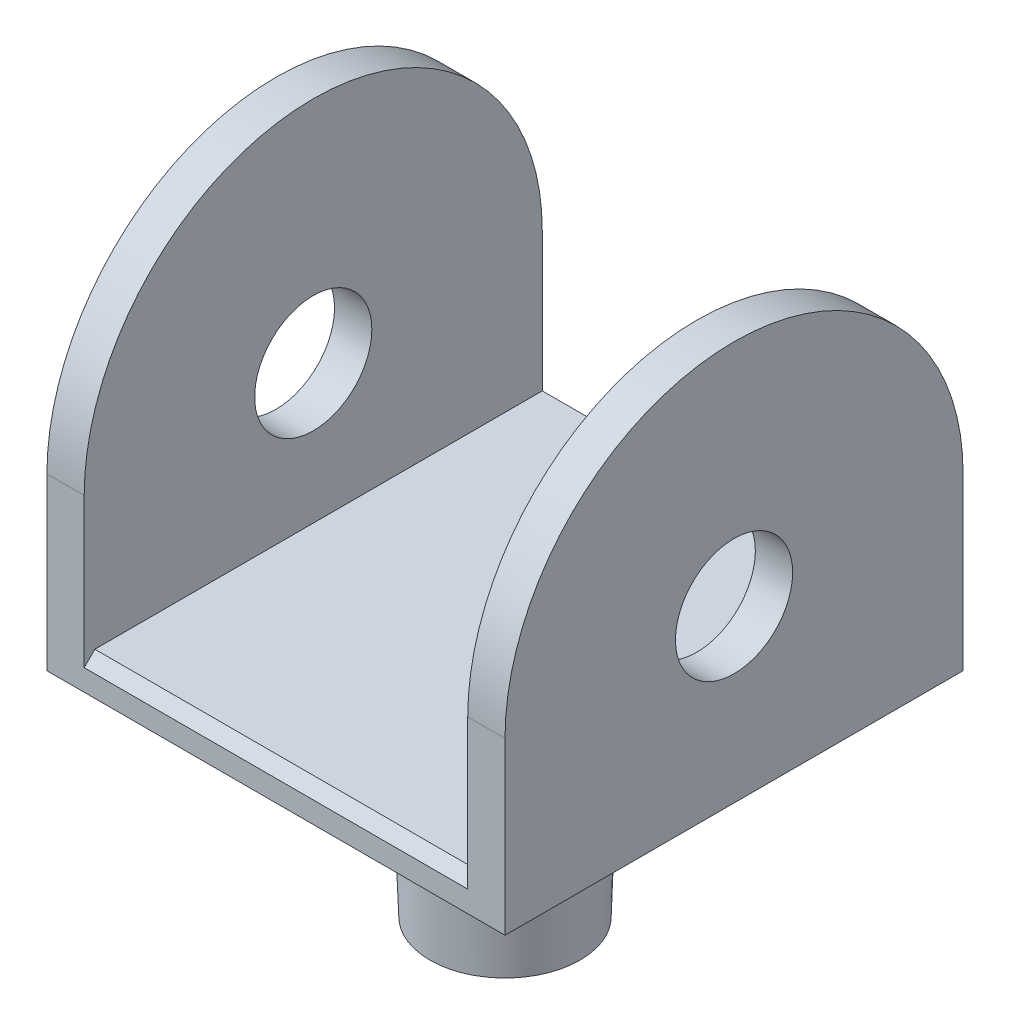
ISO-10303-21;
HEADER;
FILE_DESCRIPTION(('STEP AP214'),'2;1');
FILE_NAME('part.step','',(''),(''),'','','');
FILE_SCHEMA(('AUTOMOTIVE_DESIGN { 1 0 10303 214 1 1 1 1 }'));
ENDSEC;
DATA;
#1=APPLICATION_CONTEXT('core data for automotive mechanical design processes');
#2=APPLICATION_PROTOCOL_DEFINITION('international standard','automotive_design',2000,#1);
#3=PRODUCT_CONTEXT('',#1,'mechanical');
#4=PRODUCT('Part','Part','',(#3));
#5=PRODUCT_RELATED_PRODUCT_CATEGORY('part','',(#4));
#6=PRODUCT_DEFINITION_FORMATION('','',#4);
#7=PRODUCT_DEFINITION_CONTEXT('part definition',#1,'design');
#8=PRODUCT_DEFINITION('design','',#6,#7);
#9=PRODUCT_DEFINITION_SHAPE('','',#8);
#10=(LENGTH_UNIT() NAMED_UNIT(*) SI_UNIT(.MILLI.,.METRE.));
#11=(NAMED_UNIT(*) PLANE_ANGLE_UNIT() SI_UNIT($,.RADIAN.));
#12=(NAMED_UNIT(*) SI_UNIT($,.STERADIAN.) SOLID_ANGLE_UNIT());
#13=UNCERTAINTY_MEASURE_WITH_UNIT(LENGTH_MEASURE(1.E-05),#10,'distance_accuracy_value','');
#14=(GEOMETRIC_REPRESENTATION_CONTEXT(3) GLOBAL_UNCERTAINTY_ASSIGNED_CONTEXT((#13)) GLOBAL_UNIT_ASSIGNED_CONTEXT((#10,
#11,#12)) REPRESENTATION_CONTEXT('',''));
#15=CARTESIAN_POINT('',(0.,0.,0.));
#16=DIRECTION('',(0.,0.,1.));
#17=DIRECTION('',(1.,0.,0.));
#18=AXIS2_PLACEMENT_3D('',#15,#16,#17);
#19=CARTESIAN_POINT('',(-153.258786497948,32.,0.));
#20=DIRECTION('',(1.,0.,0.));
#21=DIRECTION('',(0.,0.,-1.));
#22=AXIS2_PLACEMENT_3D('',#19,#20,#21);
#23=CYLINDRICAL_SURFACE('',#22,43.);
#24=CARTESIAN_POINT('',(36.,32.,0.));
#25=DIRECTION('',(1.,0.,0.));
#26=DIRECTION('',(0.,0.,1.));
#27=AXIS2_PLACEMENT_3D('',#24,#25,#26);
#28=CIRCLE('',#27,43.);
#29=CARTESIAN_POINT('',(36.,32.,-43.));
#30=VERTEX_POINT('',#29);
#31=CARTESIAN_POINT('',(36.,32.,43.));
#32=VERTEX_POINT('',#31);
#33=EDGE_CURVE('E141',#30,#32,#28,.T.);
#34=ORIENTED_EDGE('',*,*,#33,.T.);
#35=DIRECTION('',(1.,0.,0.));
#36=VECTOR('',#35,1.);
#37=CARTESIAN_POINT('',(-153.258786497948,32.,43.));
#38=LINE('',#37,#36);
#39=CARTESIAN_POINT('',(43.,32.,43.));
#40=VERTEX_POINT('',#39);
#41=EDGE_CURVE('E154',#32,#40,#38,.T.);
#42=ORIENTED_EDGE('',*,*,#41,.T.);
#43=CARTESIAN_POINT('',(43.,32.,0.));
#44=DIRECTION('',(-1.,0.,0.));
#45=DIRECTION('',(0.,0.,1.));
#46=AXIS2_PLACEMENT_3D('',#43,#44,#45);
#47=CIRCLE('',#46,43.);
#48=CARTESIAN_POINT('',(43.,32.,-43.));
#49=VERTEX_POINT('',#48);
#50=EDGE_CURVE('E144',#40,#49,#47,.T.);
#51=ORIENTED_EDGE('',*,*,#50,.T.);
#52=DIRECTION('',(1.,0.,0.));
#53=VECTOR('',#52,1.);
#54=CARTESIAN_POINT('',(-153.258786497948,32.,-43.));
#55=LINE('',#54,#53);
#56=EDGE_CURVE('E151',#30,#49,#55,.T.);
#57=ORIENTED_EDGE('',*,*,#56,.F.);
#58=EDGE_LOOP('',(#34,#42,#51,#57));
#59=FACE_BOUND('',#58,.T.);
#60=ADVANCED_FACE('F37',(#59),#23,.T.);
#61=CARTESIAN_POINT('',(-153.258786497948,32.,0.));
#62=DIRECTION('',(1.,0.,0.));
#63=DIRECTION('',(0.,0.,-1.));
#64=AXIS2_PLACEMENT_3D('',#61,#62,#63);
#65=CYLINDRICAL_SURFACE('',#64,11.);
#66=CARTESIAN_POINT('',(43.,32.,0.));
#67=DIRECTION('',(-1.,0.,0.));
#68=DIRECTION('',(0.,0.,1.));
#69=AXIS2_PLACEMENT_3D('',#66,#67,#68);
#70=CIRCLE('',#69,11.);
#71=CARTESIAN_POINT('',(43.,32.,11.));
#72=VERTEX_POINT('',#71);
#73=EDGE_CURVE('E125',#72,#72,#70,.T.);
#74=ORIENTED_EDGE('',*,*,#73,.F.);
#75=EDGE_LOOP('',(#74));
#76=FACE_BOUND('',#75,.T.);
#77=CARTESIAN_POINT('',(36.,32.,0.));
#78=DIRECTION('',(1.,0.,0.));
#79=DIRECTION('',(0.,0.,-1.));
#80=AXIS2_PLACEMENT_3D('',#77,#78,#79);
#81=CIRCLE('',#80,11.);
#82=CARTESIAN_POINT('',(36.,32.,-11.));
#83=VERTEX_POINT('',#82);
#84=EDGE_CURVE('E354',#83,#83,#81,.T.);
#85=ORIENTED_EDGE('',*,*,#84,.F.);
#86=EDGE_LOOP('',(#85));
#87=FACE_BOUND('',#86,.T.);
#88=ADVANCED_FACE('F220',(#76,#87),#65,.F.);
#89=CARTESIAN_POINT('',(0.,-40.,0.));
#90=DIRECTION('',(0.,1.,0.));
#91=DIRECTION('',(0.,0.,1.));
#92=AXIS2_PLACEMENT_3D('',#89,#90,#91);
#93=CONICAL_SURFACE('',#92,14.1031692203304,0.0349065850398794);
#94=CARTESIAN_POINT('',(0.,-1.93020100659501,0.));
#95=DIRECTION('',(0.,1.,0.));
#96=DIRECTION('',(0.,0.,1.));
#97=AXIS2_PLACEMENT_3D('',#94,#95,#96);
#98=CIRCLE('',#97,15.432595895576);
#99=CARTESIAN_POINT('',(0.,-1.93020100659501,15.432595895576));
#100=VERTEX_POINT('',#99);
#101=EDGE_CURVE('E185',#100,#100,#98,.F.);
#102=ORIENTED_EDGE('',*,*,#101,.T.);
#103=EDGE_LOOP('',(#102));
#104=FACE_BOUND('',#103,.T.);
#105=CARTESIAN_POINT('',(0.,-40.,0.));
#106=DIRECTION('',(0.,-1.,0.));
#107=DIRECTION('',(0.,0.,-1.));
#108=AXIS2_PLACEMENT_3D('',#105,#106,#107);
#109=CIRCLE('',#108,14.1031692203304);
#110=CARTESIAN_POINT('',(0.,-40.,-14.1031692203304));
#111=VERTEX_POINT('',#110);
#112=EDGE_CURVE('E182',#111,#111,#109,.T.);
#113=ORIENTED_EDGE('',*,*,#112,.F.);
#114=EDGE_LOOP('',(#113));
#115=FACE_BOUND('',#114,.T.);
#116=ADVANCED_FACE('F225',(#104,#115),#93,.T.);
#117=CARTESIAN_POINT('',(14.1031692203304,-40.,0.));
#118=DIRECTION('',(0.,-1.,0.));
#119=DIRECTION('',(0.,0.,-1.));
#120=AXIS2_PLACEMENT_3D('',#117,#118,#119);
#121=PLANE('',#120);
#122=ORIENTED_EDGE('',*,*,#112,.T.);
#123=EDGE_LOOP('',(#122));
#124=FACE_BOUND('',#123,.T.);
#125=ADVANCED_FACE('F248',(#124),#121,.T.);
#126=CARTESIAN_POINT('',(43.,6.,43.));
#127=DIRECTION('',(-1.,0.,0.));
#128=DIRECTION('',(0.,0.,1.));
#129=AXIS2_PLACEMENT_3D('',#126,#127,#128);
#130=PLANE('',#129);
#131=DIRECTION('',(0.,0.,-1.));
#132=VECTOR('',#131,1.);
#133=CARTESIAN_POINT('',(43.,0.,43.));
#134=LINE('',#133,#132);
#135=CARTESIAN_POINT('',(43.,0.,43.));
#136=VERTEX_POINT('',#135);
#137=CARTESIAN_POINT('',(43.,0.,-43.));
#138=VERTEX_POINT('',#137);
#139=EDGE_CURVE('E161',#136,#138,#134,.T.);
#140=ORIENTED_EDGE('',*,*,#139,.T.);
#141=DIRECTION('',(0.,-1.,0.));
#142=VECTOR('',#141,1.);
#143=CARTESIAN_POINT('',(43.,6.,-43.));
#144=LINE('',#143,#142);
#145=EDGE_CURVE('E179',#49,#138,#144,.T.);
#146=ORIENTED_EDGE('',*,*,#145,.F.);
#147=ORIENTED_EDGE('',*,*,#50,.F.);
#148=DIRECTION('',(0.,-1.,0.));
#149=VECTOR('',#148,1.);
#150=CARTESIAN_POINT('',(43.,6.,43.));
#151=LINE('',#150,#149);
#152=EDGE_CURVE('E170',#40,#136,#151,.T.);
#153=ORIENTED_EDGE('',*,*,#152,.T.);
#154=EDGE_LOOP('',(#140,#146,#147,#153));
#155=FACE_BOUND('',#154,.T.);
#156=ORIENTED_EDGE('',*,*,#73,.T.);
#157=EDGE_LOOP('',(#156));
#158=FACE_BOUND('',#157,.T.);
#159=ADVANCED_FACE('F214',(#155,#158),#130,.F.);
#160=CARTESIAN_POINT('',(-43.,6.,-43.));
#161=DIRECTION('',(0.,0.,1.));
#162=DIRECTION('',(1.,0.,0.));
#163=AXIS2_PLACEMENT_3D('',#160,#161,#162);
#164=PLANE('',#163);
#165=CARTESIAN_POINT('',(-43.,32.,-43.));
#166=VERTEX_POINT('',#165);
#167=CARTESIAN_POINT('',(-36.,32.,-43.));
#168=VERTEX_POINT('',#167);
#169=EDGE_CURVE('E131',#166,#168,#55,.T.);
#170=ORIENTED_EDGE('',*,*,#169,.T.);
#171=DIRECTION('',(0.,1.,0.));
#172=VECTOR('',#171,1.);
#173=CARTESIAN_POINT('',(-36.,32.,-43.));
#174=LINE('',#173,#172);
#175=CARTESIAN_POINT('',(-36.,6.,-43.));
#176=VERTEX_POINT('',#175);
#177=EDGE_CURVE('E110',#176,#168,#174,.T.);
#178=ORIENTED_EDGE('',*,*,#177,.F.);
#179=DIRECTION('',(1.,0.,0.));
#180=VECTOR('',#179,1.);
#181=CARTESIAN_POINT('',(-36.,6.,-43.));
#182=LINE('',#181,#180);
#183=CARTESIAN_POINT('',(36.,6.,-43.));
#184=VERTEX_POINT('',#183);
#185=EDGE_CURVE('E118',#176,#184,#182,.T.);
#186=ORIENTED_EDGE('',*,*,#185,.T.);
#187=DIRECTION('',(0.,1.,0.));
#188=VECTOR('',#187,1.);
#189=CARTESIAN_POINT('',(36.,32.,-43.));
#190=LINE('',#189,#188);
#191=EDGE_CURVE('E139',#184,#30,#190,.T.);
#192=ORIENTED_EDGE('',*,*,#191,.T.);
#193=ORIENTED_EDGE('',*,*,#56,.T.);
#194=ORIENTED_EDGE('',*,*,#145,.T.);
#195=DIRECTION('',(-1.,0.,0.));
#196=VECTOR('',#195,1.);
#197=CARTESIAN_POINT('',(-43.,0.,-43.));
#198=LINE('',#197,#196);
#199=CARTESIAN_POINT('',(-43.,0.,-43.));
#200=VERTEX_POINT('',#199);
#201=EDGE_CURVE('E164',#138,#200,#198,.T.);
#202=ORIENTED_EDGE('',*,*,#201,.T.);
#203=DIRECTION('',(0.,-1.,0.));
#204=VECTOR('',#203,1.);
#205=CARTESIAN_POINT('',(-43.,6.,-43.));
#206=LINE('',#205,#204);
#207=EDGE_CURVE('E176',#166,#200,#206,.T.);
#208=ORIENTED_EDGE('',*,*,#207,.F.);
#209=EDGE_LOOP('',(#170,#178,#186,#192,#193,#194,#202,#208));
#210=FACE_BOUND('',#209,.T.);
#211=ADVANCED_FACE('F129',(#210),#164,.F.);
#212=CARTESIAN_POINT('',(-43.,6.,43.));
#213=DIRECTION('',(1.,0.,0.));
#214=DIRECTION('',(0.,0.,-1.));
#215=AXIS2_PLACEMENT_3D('',#212,#213,#214);
#216=PLANE('',#215);
#217=DIRECTION('',(0.,0.,1.));
#218=VECTOR('',#217,1.);
#219=CARTESIAN_POINT('',(-43.,0.,43.));
#220=LINE('',#219,#218);
#221=CARTESIAN_POINT('',(-43.,0.,43.));
#222=VERTEX_POINT('',#221);
#223=EDGE_CURVE('E166',#200,#222,#220,.T.);
#224=ORIENTED_EDGE('',*,*,#223,.T.);
#225=DIRECTION('',(0.,-1.,0.));
#226=VECTOR('',#225,1.);
#227=CARTESIAN_POINT('',(-43.,6.,43.));
#228=LINE('',#227,#226);
#229=CARTESIAN_POINT('',(-43.,32.,43.));
#230=VERTEX_POINT('',#229);
#231=EDGE_CURVE('E173',#230,#222,#228,.T.);
#232=ORIENTED_EDGE('',*,*,#231,.F.);
#233=CARTESIAN_POINT('',(-43.,32.,0.));
#234=DIRECTION('',(1.,0.,0.));
#235=DIRECTION('',(0.,0.,-1.));
#236=AXIS2_PLACEMENT_3D('',#233,#234,#235);
#237=CIRCLE('',#236,43.);
#238=EDGE_CURVE('E156',#166,#230,#237,.T.);
#239=ORIENTED_EDGE('',*,*,#238,.F.);
#240=ORIENTED_EDGE('',*,*,#207,.T.);
#241=EDGE_LOOP('',(#224,#232,#239,#240));
#242=FACE_BOUND('',#241,.T.);
#243=CARTESIAN_POINT('',(-43.,32.,0.));
#244=DIRECTION('',(1.,0.,0.));
#245=DIRECTION('',(0.,0.,-1.));
#246=AXIS2_PLACEMENT_3D('',#243,#244,#245);
#247=CIRCLE('',#246,11.);
#248=CARTESIAN_POINT('',(-43.,32.,-11.));
#249=VERTEX_POINT('',#248);
#250=EDGE_CURVE('E147',#249,#249,#247,.T.);
#251=ORIENTED_EDGE('',*,*,#250,.T.);
#252=EDGE_LOOP('',(#251));
#253=FACE_BOUND('',#252,.T.);
#254=ADVANCED_FACE('F204',(#242,#253),#216,.F.);
#255=CARTESIAN_POINT('',(-43.,6.,43.));
#256=DIRECTION('',(0.,0.,-1.));
#257=DIRECTION('',(-1.,0.,0.));
#258=AXIS2_PLACEMENT_3D('',#255,#256,#257);
#259=PLANE('',#258);
#260=DIRECTION('',(0.,-1.,0.));
#261=VECTOR('',#260,1.);
#262=CARTESIAN_POINT('',(36.,6.,43.));
#263=LINE('',#262,#261);
#264=CARTESIAN_POINT('',(36.,4.,43.));
#265=VERTEX_POINT('',#264);
#266=EDGE_CURVE('E53',#32,#265,#263,.T.);
#267=ORIENTED_EDGE('',*,*,#266,.T.);
#268=DIRECTION('',(-1.,0.,0.));
#269=VECTOR('',#268,1.);
#270=CARTESIAN_POINT('',(-43.,4.,43.));
#271=LINE('',#270,#269);
#272=CARTESIAN_POINT('',(-36.,4.,43.));
#273=VERTEX_POINT('',#272);
#274=EDGE_CURVE('E193',#265,#273,#271,.T.);
#275=ORIENTED_EDGE('',*,*,#274,.T.);
#276=DIRECTION('',(0.,-1.,0.));
#277=VECTOR('',#276,1.);
#278=CARTESIAN_POINT('',(-36.,6.,43.));
#279=LINE('',#278,#277);
#280=CARTESIAN_POINT('',(-36.,32.,43.));
#281=VERTEX_POINT('',#280);
#282=EDGE_CURVE('E60',#281,#273,#279,.T.);
#283=ORIENTED_EDGE('',*,*,#282,.F.);
#284=EDGE_CURVE('E148',#230,#281,#38,.T.);
#285=ORIENTED_EDGE('',*,*,#284,.F.);
#286=ORIENTED_EDGE('',*,*,#231,.T.);
#287=DIRECTION('',(1.,0.,0.));
#288=VECTOR('',#287,1.);
#289=CARTESIAN_POINT('',(-43.,0.,43.));
#290=LINE('',#289,#288);
#291=EDGE_CURVE('E168',#222,#136,#290,.T.);
#292=ORIENTED_EDGE('',*,*,#291,.T.);
#293=ORIENTED_EDGE('',*,*,#152,.F.);
#294=ORIENTED_EDGE('',*,*,#41,.F.);
#295=EDGE_LOOP('',(#267,#275,#283,#285,#286,#292,#293,#294));
#296=FACE_BOUND('',#295,.T.);
#297=ADVANCED_FACE('F198',(#296),#259,.F.);
#298=CARTESIAN_POINT('',(0.,0.,0.));
#299=DIRECTION('',(0.,-1.,0.));
#300=DIRECTION('',(0.,0.,-1.));
#301=AXIS2_PLACEMENT_3D('',#298,#299,#300);
#302=PLANE('',#301);
#303=CARTESIAN_POINT('',(0.,0.,0.));
#304=DIRECTION('',(0.,-1.,0.));
#305=DIRECTION('',(0.,0.,-1.));
#306=AXIS2_PLACEMENT_3D('',#303,#304,#305);
#307=CIRCLE('',#306,17.4313775496142);
#308=CARTESIAN_POINT('',(0.,0.,-17.4313775496142));
#309=VERTEX_POINT('',#308);
#310=EDGE_CURVE('E188',#309,#309,#307,.F.);
#311=ORIENTED_EDGE('',*,*,#310,.T.);
#312=EDGE_LOOP('',(#311));
#313=FACE_BOUND('',#312,.T.);
#314=ORIENTED_EDGE('',*,*,#139,.F.);
#315=ORIENTED_EDGE('',*,*,#291,.F.);
#316=ORIENTED_EDGE('',*,*,#223,.F.);
#317=ORIENTED_EDGE('',*,*,#201,.F.);
#318=EDGE_LOOP('',(#314,#315,#316,#317));
#319=FACE_BOUND('',#318,.T.);
#320=ADVANCED_FACE('F211',(#313,#319),#302,.T.);
#321=CARTESIAN_POINT('',(0.,-2.,0.));
#322=DIRECTION('',(0.,-1.,0.));
#323=DIRECTION('',(0.,0.,-1.));
#324=AXIS2_PLACEMENT_3D('',#321,#322,#323);
#325=TOROIDAL_SURFACE('',#324,17.4313775496142,2.);
#326=ORIENTED_EDGE('',*,*,#310,.F.);
#327=EDGE_LOOP('',(#326));
#328=FACE_BOUND('',#327,.T.);
#329=ORIENTED_EDGE('',*,*,#101,.F.);
#330=EDGE_LOOP('',(#329));
#331=FACE_BOUND('',#330,.T.);
#332=ADVANCED_FACE('F231',(#328,#331),#325,.F.);
#333=ORIENTED_EDGE('',*,*,#284,.T.);
#334=CARTESIAN_POINT('',(-36.,32.,0.));
#335=DIRECTION('',(1.,0.,0.));
#336=DIRECTION('',(0.,0.,1.));
#337=AXIS2_PLACEMENT_3D('',#334,#335,#336);
#338=CIRCLE('',#337,43.);
#339=EDGE_CURVE('E126',#168,#281,#338,.T.);
#340=ORIENTED_EDGE('',*,*,#339,.F.);
#341=ORIENTED_EDGE('',*,*,#169,.F.);
#342=ORIENTED_EDGE('',*,*,#238,.T.);
#343=EDGE_LOOP('',(#333,#340,#341,#342));
#344=FACE_BOUND('',#343,.T.);
#345=ADVANCED_FACE('F201',(#344),#23,.T.);
#346=CARTESIAN_POINT('',(-36.,32.,0.));
#347=DIRECTION('',(1.,0.,0.));
#348=DIRECTION('',(0.,0.,-1.));
#349=AXIS2_PLACEMENT_3D('',#346,#347,#348);
#350=CIRCLE('',#349,11.);
#351=CARTESIAN_POINT('',(-36.,32.,-11.));
#352=VERTEX_POINT('',#351);
#353=EDGE_CURVE('E137',#352,#352,#350,.T.);
#354=ORIENTED_EDGE('',*,*,#353,.T.);
#355=EDGE_LOOP('',(#354));
#356=FACE_BOUND('',#355,.T.);
#357=ORIENTED_EDGE('',*,*,#250,.F.);
#358=EDGE_LOOP('',(#357));
#359=FACE_BOUND('',#358,.T.);
#360=ADVANCED_FACE('F228',(#356,#359),#65,.F.);
#361=CARTESIAN_POINT('',(-36.,6.,43.));
#362=DIRECTION('',(0.,-1.,0.));
#363=DIRECTION('',(0.,0.,-1.));
#364=AXIS2_PLACEMENT_3D('',#361,#362,#363);
#365=PLANE('',#364);
#366=DIRECTION('',(0.,0.,-1.));
#367=VECTOR('',#366,1.);
#368=CARTESIAN_POINT('',(-36.,6.,43.));
#369=LINE('',#368,#367);
#370=CARTESIAN_POINT('',(-36.,6.,41.));
#371=VERTEX_POINT('',#370);
#372=EDGE_CURVE('E106',#371,#176,#369,.T.);
#373=ORIENTED_EDGE('',*,*,#372,.F.);
#374=DIRECTION('',(1.,0.,0.));
#375=VECTOR('',#374,1.);
#376=CARTESIAN_POINT('',(-36.,6.,41.));
#377=LINE('',#376,#375);
#378=CARTESIAN_POINT('',(36.,6.,41.));
#379=VERTEX_POINT('',#378);
#380=EDGE_CURVE('E191',#371,#379,#377,.T.);
#381=ORIENTED_EDGE('',*,*,#380,.T.);
#382=DIRECTION('',(0.,0.,-1.));
#383=VECTOR('',#382,1.);
#384=CARTESIAN_POINT('',(36.,6.,43.));
#385=LINE('',#384,#383);
#386=EDGE_CURVE('E121',#379,#184,#385,.T.);
#387=ORIENTED_EDGE('',*,*,#386,.T.);
#388=ORIENTED_EDGE('',*,*,#185,.F.);
#389=EDGE_LOOP('',(#373,#381,#387,#388));
#390=FACE_BOUND('',#389,.T.);
#391=ADVANCED_FACE('F119',(#390),#365,.F.);
#392=CARTESIAN_POINT('',(-36.,32.,0.));
#393=DIRECTION('',(-1.,0.,0.));
#394=DIRECTION('',(0.,0.,1.));
#395=AXIS2_PLACEMENT_3D('',#392,#393,#394);
#396=PLANE('',#395);
#397=ORIENTED_EDGE('',*,*,#353,.F.);
#398=EDGE_LOOP('',(#397));
#399=FACE_BOUND('',#398,.T.);
#400=ORIENTED_EDGE('',*,*,#282,.T.);
#401=DIRECTION('',(0.,-0.707106781186548,0.707106781186548));
#402=VECTOR('',#401,1.);
#403=CARTESIAN_POINT('',(-36.,39.5,7.5));
#404=LINE('',#403,#402);
#405=EDGE_CURVE('E11',#273,#371,#404,.F.);
#406=ORIENTED_EDGE('',*,*,#405,.T.);
#407=ORIENTED_EDGE('',*,*,#372,.T.);
#408=ORIENTED_EDGE('',*,*,#177,.T.);
#409=ORIENTED_EDGE('',*,*,#339,.T.);
#410=EDGE_LOOP('',(#400,#406,#407,#408,#409));
#411=FACE_BOUND('',#410,.T.);
#412=ADVANCED_FACE('F108',(#399,#411),#396,.F.);
#413=CARTESIAN_POINT('',(36.,32.,0.));
#414=DIRECTION('',(-1.,0.,0.));
#415=DIRECTION('',(0.,0.,1.));
#416=AXIS2_PLACEMENT_3D('',#413,#414,#415);
#417=PLANE('',#416);
#418=ORIENTED_EDGE('',*,*,#84,.T.);
#419=EDGE_LOOP('',(#418));
#420=FACE_BOUND('',#419,.T.);
#421=ORIENTED_EDGE('',*,*,#266,.F.);
#422=ORIENTED_EDGE('',*,*,#33,.F.);
#423=ORIENTED_EDGE('',*,*,#191,.F.);
#424=ORIENTED_EDGE('',*,*,#386,.F.);
#425=DIRECTION('',(0.,0.707106781186548,-0.707106781186548));
#426=VECTOR('',#425,1.);
#427=CARTESIAN_POINT('',(36.,6.,41.));
#428=LINE('',#427,#426);
#429=EDGE_CURVE('E46',#379,#265,#428,.F.);
#430=ORIENTED_EDGE('',*,*,#429,.T.);
#431=EDGE_LOOP('',(#421,#422,#423,#424,#430));
#432=FACE_BOUND('',#431,.T.);
#433=ADVANCED_FACE('F196',(#420,#432),#417,.T.);
#434=CARTESIAN_POINT('',(-36.,6.,41.));
#435=DIRECTION('',(0.,-0.707106781186547,-0.707106781186547));
#436=DIRECTION('',(1.,0.,0.));
#437=AXIS2_PLACEMENT_3D('',#434,#435,#436);
#438=PLANE('',#437);
#439=ORIENTED_EDGE('',*,*,#405,.F.);
#440=ORIENTED_EDGE('',*,*,#274,.F.);
#441=ORIENTED_EDGE('',*,*,#429,.F.);
#442=ORIENTED_EDGE('',*,*,#380,.F.);
#443=EDGE_LOOP('',(#439,#440,#441,#442));
#444=FACE_BOUND('',#443,.T.);
#445=ADVANCED_FACE('F40',(#444),#438,.F.);
#446=CLOSED_SHELL('',(#60,#88,#116,#125,#159,#211,#254,#297,#320,#332,#345,#360,#391,#412,#433,#445));
#447=MANIFOLD_SOLID_BREP('B2',#446);
#448=ADVANCED_BREP_SHAPE_REPRESENTATION('',(#18,#447),#14);
#449=SHAPE_DEFINITION_REPRESENTATION(#9,#448);
ENDSEC;
END-ISO-10303-21;
